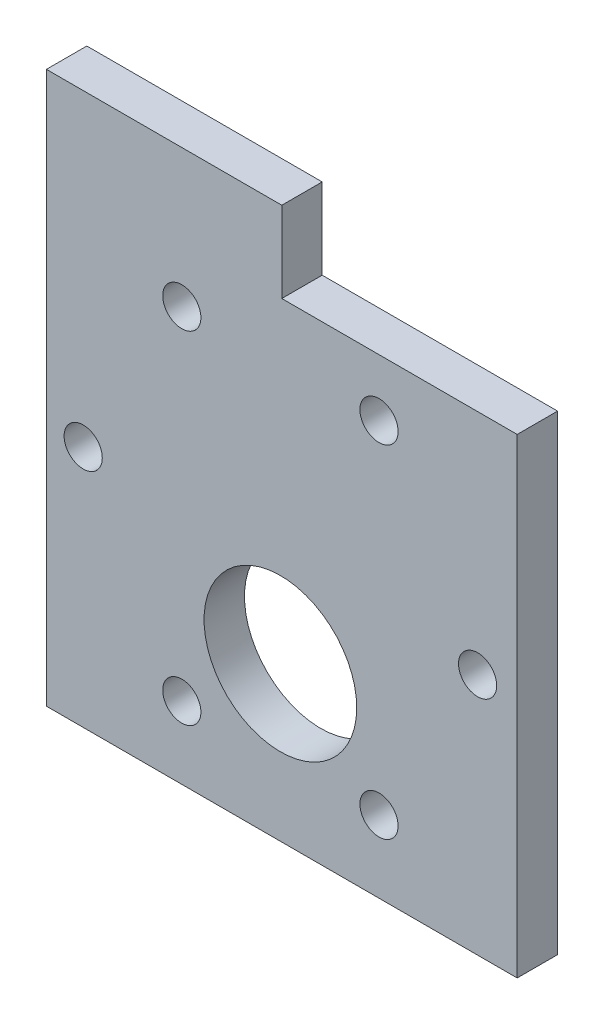
ISO-10303-21;
HEADER;
FILE_DESCRIPTION(('STEP AP214'),'2;1');
FILE_NAME('part.step','',(''),(''),'','','');
FILE_SCHEMA(('AUTOMOTIVE_DESIGN { 1 0 10303 214 1 1 1 1 }'));
ENDSEC;
DATA;
#1=APPLICATION_CONTEXT('core data for automotive mechanical design processes');
#2=APPLICATION_PROTOCOL_DEFINITION('international standard','automotive_design',2000,#1);
#3=PRODUCT_CONTEXT('',#1,'mechanical');
#4=PRODUCT('Part','Part','',(#3));
#5=PRODUCT_RELATED_PRODUCT_CATEGORY('part','',(#4));
#6=PRODUCT_DEFINITION_FORMATION('','',#4);
#7=PRODUCT_DEFINITION_CONTEXT('part definition',#1,'design');
#8=PRODUCT_DEFINITION('design','',#6,#7);
#9=PRODUCT_DEFINITION_SHAPE('','',#8);
#10=(LENGTH_UNIT() NAMED_UNIT(*) SI_UNIT(.MILLI.,.METRE.));
#11=(NAMED_UNIT(*) PLANE_ANGLE_UNIT() SI_UNIT($,.RADIAN.));
#12=(NAMED_UNIT(*) SI_UNIT($,.STERADIAN.) SOLID_ANGLE_UNIT());
#13=UNCERTAINTY_MEASURE_WITH_UNIT(LENGTH_MEASURE(1.E-05),#10,'distance_accuracy_value','');
#14=(GEOMETRIC_REPRESENTATION_CONTEXT(3) GLOBAL_UNCERTAINTY_ASSIGNED_CONTEXT((#13)) GLOBAL_UNIT_ASSIGNED_CONTEXT((#10,
#11,#12)) REPRESENTATION_CONTEXT('',''));
#15=CARTESIAN_POINT('',(0.,0.,0.));
#16=DIRECTION('',(0.,0.,1.));
#17=DIRECTION('',(1.,0.,0.));
#18=AXIS2_PLACEMENT_3D('',#15,#16,#17);
#19=CARTESIAN_POINT('',(0.,0.,3.175));
#20=DIRECTION('',(0.,0.,-1.));
#21=DIRECTION('',(-1.,0.,0.));
#22=AXIS2_PLACEMENT_3D('',#19,#20,#21);
#23=PLANE('',#22);
#24=DIRECTION('',(1.,0.,0.));
#25=VECTOR('',#24,1.);
#26=CARTESIAN_POINT('',(18.5,0.,3.175));
#27=LINE('',#26,#25);
#28=CARTESIAN_POINT('',(0.,0.,3.175));
#29=VERTEX_POINT('',#28);
#30=CARTESIAN_POINT('',(37.,0.,3.175));
#31=VERTEX_POINT('',#30);
#32=EDGE_CURVE('E82',#29,#31,#27,.T.);
#33=ORIENTED_EDGE('',*,*,#32,.T.);
#34=DIRECTION('',(0.,1.,0.));
#35=VECTOR('',#34,1.);
#36=CARTESIAN_POINT('',(37.,0.,3.175));
#37=LINE('',#36,#35);
#38=CARTESIAN_POINT('',(37.,37.,3.175));
#39=VERTEX_POINT('',#38);
#40=EDGE_CURVE('E143',#31,#39,#37,.T.);
#41=ORIENTED_EDGE('',*,*,#40,.T.);
#42=DIRECTION('',(-1.,0.,0.));
#43=VECTOR('',#42,1.);
#44=CARTESIAN_POINT('',(18.5,37.,3.175));
#45=LINE('',#44,#43);
#46=CARTESIAN_POINT('',(18.5,37.,3.175));
#47=VERTEX_POINT('',#46);
#48=EDGE_CURVE('E97',#39,#47,#45,.T.);
#49=ORIENTED_EDGE('',*,*,#48,.T.);
#50=DIRECTION('',(0.,1.,0.));
#51=VECTOR('',#50,1.);
#52=CARTESIAN_POINT('',(18.5,37.,3.175));
#53=LINE('',#52,#51);
#54=CARTESIAN_POINT('',(18.5,43.35,3.175));
#55=VERTEX_POINT('',#54);
#56=EDGE_CURVE('E90',#47,#55,#53,.T.);
#57=ORIENTED_EDGE('',*,*,#56,.T.);
#58=DIRECTION('',(-1.,0.,0.));
#59=VECTOR('',#58,1.);
#60=CARTESIAN_POINT('',(18.5,43.35,3.175));
#61=LINE('',#60,#59);
#62=CARTESIAN_POINT('',(0.,43.35,3.175));
#63=VERTEX_POINT('',#62);
#64=EDGE_CURVE('E94',#55,#63,#61,.T.);
#65=ORIENTED_EDGE('',*,*,#64,.T.);
#66=DIRECTION('',(0.,-1.,0.));
#67=VECTOR('',#66,1.);
#68=CARTESIAN_POINT('',(0.,43.35,3.175));
#69=LINE('',#68,#67);
#70=EDGE_CURVE('E50',#63,#29,#69,.T.);
#71=ORIENTED_EDGE('',*,*,#70,.T.);
#72=EDGE_LOOP('',(#33,#41,#49,#57,#65,#71));
#73=FACE_BOUND('',#72,.T.);
#74=CARTESIAN_POINT('',(18.3902331199689,12.0898739119919,3.175));
#75=DIRECTION('',(0.,0.,1.));
#76=DIRECTION('',(1.,0.,0.));
#77=AXIS2_PLACEMENT_3D('',#74,#75,#76);
#78=CIRCLE('',#77,6.00000000000002);
#79=CARTESIAN_POINT('',(24.3902331199689,12.0898739119919,3.175));
#80=VERTEX_POINT('',#79);
#81=EDGE_CURVE('E120',#80,#80,#78,.T.);
#82=ORIENTED_EDGE('',*,*,#81,.F.);
#83=EDGE_LOOP('',(#82));
#84=FACE_BOUND('',#83,.T.);
#85=CARTESIAN_POINT('',(2.89023311996889,19.089873911992,3.175));
#86=DIRECTION('',(0.,0.,1.));
#87=DIRECTION('',(1.,0.,0.));
#88=AXIS2_PLACEMENT_3D('',#85,#86,#87);
#89=CIRCLE('',#88,1.5);
#90=CARTESIAN_POINT('',(4.39023311996889,19.089873911992,3.175));
#91=VERTEX_POINT('',#90);
#92=EDGE_CURVE('E150',#91,#91,#89,.T.);
#93=ORIENTED_EDGE('',*,*,#92,.F.);
#94=EDGE_LOOP('',(#93));
#95=FACE_BOUND('',#94,.T.);
#96=CARTESIAN_POINT('',(10.6402331199689,5.66648015333317,3.175));
#97=DIRECTION('',(0.,0.,1.));
#98=DIRECTION('',(1.,0.,0.));
#99=AXIS2_PLACEMENT_3D('',#96,#97,#98);
#100=CIRCLE('',#99,1.5);
#101=CARTESIAN_POINT('',(12.1402331199689,5.66648015333317,3.175));
#102=VERTEX_POINT('',#101);
#103=EDGE_CURVE('E156',#102,#102,#100,.T.);
#104=ORIENTED_EDGE('',*,*,#103,.F.);
#105=EDGE_LOOP('',(#104));
#106=FACE_BOUND('',#105,.T.);
#107=CARTESIAN_POINT('',(26.1402331199689,5.66648015333317,3.175));
#108=DIRECTION('',(0.,0.,1.));
#109=DIRECTION('',(1.,0.,0.));
#110=AXIS2_PLACEMENT_3D('',#107,#108,#109);
#111=CIRCLE('',#110,1.5);
#112=CARTESIAN_POINT('',(27.6402331199689,5.66648015333317,3.175));
#113=VERTEX_POINT('',#112);
#114=EDGE_CURVE('E162',#113,#113,#111,.T.);
#115=ORIENTED_EDGE('',*,*,#114,.F.);
#116=EDGE_LOOP('',(#115));
#117=FACE_BOUND('',#116,.T.);
#118=CARTESIAN_POINT('',(33.8902331199689,19.089873911992,3.175));
#119=DIRECTION('',(0.,0.,1.));
#120=DIRECTION('',(1.,0.,0.));
#121=AXIS2_PLACEMENT_3D('',#118,#119,#120);
#122=CIRCLE('',#121,1.5);
#123=CARTESIAN_POINT('',(35.3902331199689,19.089873911992,3.175));
#124=VERTEX_POINT('',#123);
#125=EDGE_CURVE('E168',#124,#124,#122,.T.);
#126=ORIENTED_EDGE('',*,*,#125,.F.);
#127=EDGE_LOOP('',(#126));
#128=FACE_BOUND('',#127,.T.);
#129=CARTESIAN_POINT('',(26.1402331199689,32.5132676706507,3.175));
#130=DIRECTION('',(0.,0.,1.));
#131=DIRECTION('',(1.,0.,0.));
#132=AXIS2_PLACEMENT_3D('',#129,#130,#131);
#133=CIRCLE('',#132,1.5);
#134=CARTESIAN_POINT('',(27.6402331199689,32.5132676706507,3.175));
#135=VERTEX_POINT('',#134);
#136=EDGE_CURVE('E174',#135,#135,#133,.T.);
#137=ORIENTED_EDGE('',*,*,#136,.F.);
#138=EDGE_LOOP('',(#137));
#139=FACE_BOUND('',#138,.T.);
#140=CARTESIAN_POINT('',(10.6402331199689,32.5132676706507,3.175));
#141=DIRECTION('',(0.,0.,1.));
#142=DIRECTION('',(1.,0.,0.));
#143=AXIS2_PLACEMENT_3D('',#140,#141,#142);
#144=CIRCLE('',#143,1.5);
#145=CARTESIAN_POINT('',(12.1402331199689,32.5132676706507,3.175));
#146=VERTEX_POINT('',#145);
#147=EDGE_CURVE('E180',#146,#146,#144,.T.);
#148=ORIENTED_EDGE('',*,*,#147,.F.);
#149=EDGE_LOOP('',(#148));
#150=FACE_BOUND('',#149,.T.);
#151=ADVANCED_FACE('F33',(#73,#84,#95,#106,#117,#128,#139,#150),#23,.F.);
#152=CARTESIAN_POINT('',(0.,0.,0.));
#153=DIRECTION('',(0.,0.,-1.));
#154=DIRECTION('',(-1.,0.,0.));
#155=AXIS2_PLACEMENT_3D('',#152,#153,#154);
#156=PLANE('',#155);
#157=CARTESIAN_POINT('',(26.1402331199689,32.5132676706507,0.));
#158=DIRECTION('',(0.,0.,1.));
#159=DIRECTION('',(1.,0.,0.));
#160=AXIS2_PLACEMENT_3D('',#157,#158,#159);
#161=CIRCLE('',#160,1.5);
#162=CARTESIAN_POINT('',(27.6402331199689,32.5132676706507,0.));
#163=VERTEX_POINT('',#162);
#164=EDGE_CURVE('E177',#163,#163,#161,.T.);
#165=ORIENTED_EDGE('',*,*,#164,.T.);
#166=EDGE_LOOP('',(#165));
#167=FACE_BOUND('',#166,.T.);
#168=CARTESIAN_POINT('',(26.1402331199689,5.66648015333317,0.));
#169=DIRECTION('',(0.,0.,1.));
#170=DIRECTION('',(1.,0.,0.));
#171=AXIS2_PLACEMENT_3D('',#168,#169,#170);
#172=CIRCLE('',#171,1.5);
#173=CARTESIAN_POINT('',(27.6402331199689,5.66648015333317,0.));
#174=VERTEX_POINT('',#173);
#175=EDGE_CURVE('E165',#174,#174,#172,.T.);
#176=ORIENTED_EDGE('',*,*,#175,.T.);
#177=EDGE_LOOP('',(#176));
#178=FACE_BOUND('',#177,.T.);
#179=CARTESIAN_POINT('',(2.89023311996889,19.089873911992,0.));
#180=DIRECTION('',(0.,0.,1.));
#181=DIRECTION('',(1.,0.,0.));
#182=AXIS2_PLACEMENT_3D('',#179,#180,#181);
#183=CIRCLE('',#182,1.5);
#184=CARTESIAN_POINT('',(4.39023311996889,19.089873911992,0.));
#185=VERTEX_POINT('',#184);
#186=EDGE_CURVE('E153',#185,#185,#183,.T.);
#187=ORIENTED_EDGE('',*,*,#186,.T.);
#188=EDGE_LOOP('',(#187));
#189=FACE_BOUND('',#188,.T.);
#190=DIRECTION('',(1.,0.,0.));
#191=VECTOR('',#190,1.);
#192=CARTESIAN_POINT('',(18.5,0.,0.));
#193=LINE('',#192,#191);
#194=CARTESIAN_POINT('',(0.,0.,0.));
#195=VERTEX_POINT('',#194);
#196=CARTESIAN_POINT('',(37.,0.,0.));
#197=VERTEX_POINT('',#196);
#198=EDGE_CURVE('E77',#195,#197,#193,.T.);
#199=ORIENTED_EDGE('',*,*,#198,.F.);
#200=DIRECTION('',(0.,-1.,0.));
#201=VECTOR('',#200,1.);
#202=CARTESIAN_POINT('',(0.,0.,0.));
#203=LINE('',#202,#201);
#204=CARTESIAN_POINT('',(0.,43.35,0.));
#205=VERTEX_POINT('',#204);
#206=EDGE_CURVE('E73',#205,#195,#203,.T.);
#207=ORIENTED_EDGE('',*,*,#206,.F.);
#208=DIRECTION('',(-1.,0.,0.));
#209=VECTOR('',#208,1.);
#210=CARTESIAN_POINT('',(18.5,43.35,0.));
#211=LINE('',#210,#209);
#212=CARTESIAN_POINT('',(18.5,43.35,0.));
#213=VERTEX_POINT('',#212);
#214=EDGE_CURVE('E125',#213,#205,#211,.T.);
#215=ORIENTED_EDGE('',*,*,#214,.F.);
#216=DIRECTION('',(0.,1.,0.));
#217=VECTOR('',#216,1.);
#218=CARTESIAN_POINT('',(18.5,37.,0.));
#219=LINE('',#218,#217);
#220=CARTESIAN_POINT('',(18.5,37.,0.));
#221=VERTEX_POINT('',#220);
#222=EDGE_CURVE('E106',#221,#213,#219,.T.);
#223=ORIENTED_EDGE('',*,*,#222,.F.);
#224=DIRECTION('',(-1.,0.,0.));
#225=VECTOR('',#224,1.);
#226=CARTESIAN_POINT('',(18.5,37.,0.));
#227=LINE('',#226,#225);
#228=CARTESIAN_POINT('',(37.,37.,0.));
#229=VERTEX_POINT('',#228);
#230=EDGE_CURVE('E122',#229,#221,#227,.T.);
#231=ORIENTED_EDGE('',*,*,#230,.F.);
#232=DIRECTION('',(0.,1.,0.));
#233=VECTOR('',#232,1.);
#234=CARTESIAN_POINT('',(37.,0.,0.));
#235=LINE('',#234,#233);
#236=EDGE_CURVE('E119',#197,#229,#235,.T.);
#237=ORIENTED_EDGE('',*,*,#236,.F.);
#238=EDGE_LOOP('',(#199,#207,#215,#223,#231,#237));
#239=FACE_BOUND('',#238,.T.);
#240=CARTESIAN_POINT('',(18.3902331199689,12.0898739119919,0.));
#241=DIRECTION('',(0.,0.,1.));
#242=DIRECTION('',(1.,0.,0.));
#243=AXIS2_PLACEMENT_3D('',#240,#241,#242);
#244=CIRCLE('',#243,6.00000000000002);
#245=CARTESIAN_POINT('',(24.3902331199689,12.0898739119919,0.));
#246=VERTEX_POINT('',#245);
#247=EDGE_CURVE('E147',#246,#246,#244,.T.);
#248=ORIENTED_EDGE('',*,*,#247,.T.);
#249=EDGE_LOOP('',(#248));
#250=FACE_BOUND('',#249,.T.);
#251=CARTESIAN_POINT('',(10.6402331199689,5.66648015333317,0.));
#252=DIRECTION('',(0.,0.,1.));
#253=DIRECTION('',(1.,0.,0.));
#254=AXIS2_PLACEMENT_3D('',#251,#252,#253);
#255=CIRCLE('',#254,1.5);
#256=CARTESIAN_POINT('',(12.1402331199689,5.66648015333317,0.));
#257=VERTEX_POINT('',#256);
#258=EDGE_CURVE('E159',#257,#257,#255,.T.);
#259=ORIENTED_EDGE('',*,*,#258,.T.);
#260=EDGE_LOOP('',(#259));
#261=FACE_BOUND('',#260,.T.);
#262=CARTESIAN_POINT('',(33.8902331199689,19.089873911992,0.));
#263=DIRECTION('',(0.,0.,1.));
#264=DIRECTION('',(1.,0.,0.));
#265=AXIS2_PLACEMENT_3D('',#262,#263,#264);
#266=CIRCLE('',#265,1.5);
#267=CARTESIAN_POINT('',(35.3902331199689,19.089873911992,0.));
#268=VERTEX_POINT('',#267);
#269=EDGE_CURVE('E171',#268,#268,#266,.T.);
#270=ORIENTED_EDGE('',*,*,#269,.T.);
#271=EDGE_LOOP('',(#270));
#272=FACE_BOUND('',#271,.T.);
#273=CARTESIAN_POINT('',(10.6402331199689,32.5132676706507,0.));
#274=DIRECTION('',(0.,0.,1.));
#275=DIRECTION('',(1.,0.,0.));
#276=AXIS2_PLACEMENT_3D('',#273,#274,#275);
#277=CIRCLE('',#276,1.5);
#278=CARTESIAN_POINT('',(12.1402331199689,32.5132676706507,0.));
#279=VERTEX_POINT('',#278);
#280=EDGE_CURVE('E183',#279,#279,#277,.T.);
#281=ORIENTED_EDGE('',*,*,#280,.T.);
#282=EDGE_LOOP('',(#281));
#283=FACE_BOUND('',#282,.T.);
#284=ADVANCED_FACE('F138',(#167,#178,#189,#239,#250,#261,#272,#283),#156,.T.);
#285=CARTESIAN_POINT('',(18.5,0.,3.175));
#286=DIRECTION('',(0.,1.,0.));
#287=DIRECTION('',(-1.,0.,0.));
#288=AXIS2_PLACEMENT_3D('',#285,#286,#287);
#289=PLANE('',#288);
#290=ORIENTED_EDGE('',*,*,#198,.T.);
#291=DIRECTION('',(0.,0.,-1.));
#292=VECTOR('',#291,1.);
#293=CARTESIAN_POINT('',(37.,0.,3.175));
#294=LINE('',#293,#292);
#295=EDGE_CURVE('E11',#31,#197,#294,.T.);
#296=ORIENTED_EDGE('',*,*,#295,.F.);
#297=ORIENTED_EDGE('',*,*,#32,.F.);
#298=DIRECTION('',(0.,0.,-1.));
#299=VECTOR('',#298,1.);
#300=CARTESIAN_POINT('',(0.,0.,3.175));
#301=LINE('',#300,#299);
#302=EDGE_CURVE('E114',#29,#195,#301,.T.);
#303=ORIENTED_EDGE('',*,*,#302,.T.);
#304=EDGE_LOOP('',(#290,#296,#297,#303));
#305=FACE_BOUND('',#304,.T.);
#306=ADVANCED_FACE('F35',(#305),#289,.F.);
#307=CARTESIAN_POINT('',(37.,0.,3.175));
#308=DIRECTION('',(-1.,0.,0.));
#309=DIRECTION('',(0.,0.,1.));
#310=AXIS2_PLACEMENT_3D('',#307,#308,#309);
#311=PLANE('',#310);
#312=ORIENTED_EDGE('',*,*,#236,.T.);
#313=DIRECTION('',(0.,0.,-1.));
#314=VECTOR('',#313,1.);
#315=CARTESIAN_POINT('',(37.,37.,3.175));
#316=LINE('',#315,#314);
#317=EDGE_CURVE('E42',#39,#229,#316,.T.);
#318=ORIENTED_EDGE('',*,*,#317,.F.);
#319=ORIENTED_EDGE('',*,*,#40,.F.);
#320=ORIENTED_EDGE('',*,*,#295,.T.);
#321=EDGE_LOOP('',(#312,#318,#319,#320));
#322=FACE_BOUND('',#321,.T.);
#323=ADVANCED_FACE('F210',(#322),#311,.F.);
#324=CARTESIAN_POINT('',(18.5,37.,3.175));
#325=DIRECTION('',(0.,-1.,0.));
#326=DIRECTION('',(0.,0.,-1.));
#327=AXIS2_PLACEMENT_3D('',#324,#325,#326);
#328=PLANE('',#327);
#329=ORIENTED_EDGE('',*,*,#230,.T.);
#330=DIRECTION('',(0.,0.,-1.));
#331=VECTOR('',#330,1.);
#332=CARTESIAN_POINT('',(18.5,37.,3.175));
#333=LINE('',#332,#331);
#334=EDGE_CURVE('E108',#47,#221,#333,.T.);
#335=ORIENTED_EDGE('',*,*,#334,.F.);
#336=ORIENTED_EDGE('',*,*,#48,.F.);
#337=ORIENTED_EDGE('',*,*,#317,.T.);
#338=EDGE_LOOP('',(#329,#335,#336,#337));
#339=FACE_BOUND('',#338,.T.);
#340=ADVANCED_FACE('F135',(#339),#328,.F.);
#341=CARTESIAN_POINT('',(18.5,37.,3.175));
#342=DIRECTION('',(-1.,0.,0.));
#343=DIRECTION('',(0.,0.,1.));
#344=AXIS2_PLACEMENT_3D('',#341,#342,#343);
#345=PLANE('',#344);
#346=ORIENTED_EDGE('',*,*,#222,.T.);
#347=DIRECTION('',(0.,0.,-1.));
#348=VECTOR('',#347,1.);
#349=CARTESIAN_POINT('',(18.5,43.35,3.175));
#350=LINE('',#349,#348);
#351=EDGE_CURVE('E103',#55,#213,#350,.T.);
#352=ORIENTED_EDGE('',*,*,#351,.F.);
#353=ORIENTED_EDGE('',*,*,#56,.F.);
#354=ORIENTED_EDGE('',*,*,#334,.T.);
#355=EDGE_LOOP('',(#346,#352,#353,#354));
#356=FACE_BOUND('',#355,.T.);
#357=ADVANCED_FACE('F104',(#356),#345,.F.);
#358=CARTESIAN_POINT('',(18.5,43.35,3.175));
#359=DIRECTION('',(0.,-1.,0.));
#360=DIRECTION('',(0.,0.,-1.));
#361=AXIS2_PLACEMENT_3D('',#358,#359,#360);
#362=PLANE('',#361);
#363=ORIENTED_EDGE('',*,*,#214,.T.);
#364=DIRECTION('',(0.,0.,-1.));
#365=VECTOR('',#364,1.);
#366=CARTESIAN_POINT('',(0.,43.35,3.175));
#367=LINE('',#366,#365);
#368=EDGE_CURVE('E109',#63,#205,#367,.T.);
#369=ORIENTED_EDGE('',*,*,#368,.F.);
#370=ORIENTED_EDGE('',*,*,#64,.F.);
#371=ORIENTED_EDGE('',*,*,#351,.T.);
#372=EDGE_LOOP('',(#363,#369,#370,#371));
#373=FACE_BOUND('',#372,.T.);
#374=ADVANCED_FACE('F111',(#373),#362,.F.);
#375=CARTESIAN_POINT('',(0.,0.,3.175));
#376=DIRECTION('',(1.,0.,0.));
#377=DIRECTION('',(0.,0.,-1.));
#378=AXIS2_PLACEMENT_3D('',#375,#376,#377);
#379=PLANE('',#378);
#380=ORIENTED_EDGE('',*,*,#206,.T.);
#381=ORIENTED_EDGE('',*,*,#302,.F.);
#382=ORIENTED_EDGE('',*,*,#70,.F.);
#383=ORIENTED_EDGE('',*,*,#368,.T.);
#384=EDGE_LOOP('',(#380,#381,#382,#383));
#385=FACE_BOUND('',#384,.T.);
#386=ADVANCED_FACE('F141',(#385),#379,.F.);
#387=CARTESIAN_POINT('',(18.3902331199689,12.0898739119919,3.175));
#388=DIRECTION('',(0.,0.,-1.));
#389=DIRECTION('',(-1.,0.,0.));
#390=AXIS2_PLACEMENT_3D('',#387,#388,#389);
#391=CYLINDRICAL_SURFACE('',#390,6.00000000000002);
#392=ORIENTED_EDGE('',*,*,#81,.T.);
#393=EDGE_LOOP('',(#392));
#394=FACE_BOUND('',#393,.T.);
#395=ORIENTED_EDGE('',*,*,#247,.F.);
#396=EDGE_LOOP('',(#395));
#397=FACE_BOUND('',#396,.T.);
#398=ADVANCED_FACE('F200',(#394,#397),#391,.F.);
#399=CARTESIAN_POINT('',(2.89023311996889,19.089873911992,3.175));
#400=DIRECTION('',(0.,0.,-1.));
#401=DIRECTION('',(-1.,0.,0.));
#402=AXIS2_PLACEMENT_3D('',#399,#400,#401);
#403=CYLINDRICAL_SURFACE('',#402,1.5);
#404=ORIENTED_EDGE('',*,*,#92,.T.);
#405=EDGE_LOOP('',(#404));
#406=FACE_BOUND('',#405,.T.);
#407=ORIENTED_EDGE('',*,*,#186,.F.);
#408=EDGE_LOOP('',(#407));
#409=FACE_BOUND('',#408,.T.);
#410=ADVANCED_FACE('F267',(#406,#409),#403,.F.);
#411=CARTESIAN_POINT('',(10.6402331199689,5.66648015333317,3.175));
#412=DIRECTION('',(0.,0.,-1.));
#413=DIRECTION('',(-1.,0.,0.));
#414=AXIS2_PLACEMENT_3D('',#411,#412,#413);
#415=CYLINDRICAL_SURFACE('',#414,1.5);
#416=ORIENTED_EDGE('',*,*,#103,.T.);
#417=EDGE_LOOP('',(#416));
#418=FACE_BOUND('',#417,.T.);
#419=ORIENTED_EDGE('',*,*,#258,.F.);
#420=EDGE_LOOP('',(#419));
#421=FACE_BOUND('',#420,.T.);
#422=ADVANCED_FACE('F275',(#418,#421),#415,.F.);
#423=CARTESIAN_POINT('',(26.1402331199689,5.66648015333317,3.175));
#424=DIRECTION('',(0.,0.,-1.));
#425=DIRECTION('',(-1.,0.,0.));
#426=AXIS2_PLACEMENT_3D('',#423,#424,#425);
#427=CYLINDRICAL_SURFACE('',#426,1.5);
#428=ORIENTED_EDGE('',*,*,#114,.T.);
#429=EDGE_LOOP('',(#428));
#430=FACE_BOUND('',#429,.T.);
#431=ORIENTED_EDGE('',*,*,#175,.F.);
#432=EDGE_LOOP('',(#431));
#433=FACE_BOUND('',#432,.T.);
#434=ADVANCED_FACE('F283',(#430,#433),#427,.F.);
#435=CARTESIAN_POINT('',(33.8902331199689,19.089873911992,3.175));
#436=DIRECTION('',(0.,0.,-1.));
#437=DIRECTION('',(-1.,0.,0.));
#438=AXIS2_PLACEMENT_3D('',#435,#436,#437);
#439=CYLINDRICAL_SURFACE('',#438,1.5);
#440=ORIENTED_EDGE('',*,*,#125,.T.);
#441=EDGE_LOOP('',(#440));
#442=FACE_BOUND('',#441,.T.);
#443=ORIENTED_EDGE('',*,*,#269,.F.);
#444=EDGE_LOOP('',(#443));
#445=FACE_BOUND('',#444,.T.);
#446=ADVANCED_FACE('F292',(#442,#445),#439,.F.);
#447=CARTESIAN_POINT('',(26.1402331199689,32.5132676706507,3.175));
#448=DIRECTION('',(0.,0.,-1.));
#449=DIRECTION('',(-1.,0.,0.));
#450=AXIS2_PLACEMENT_3D('',#447,#448,#449);
#451=CYLINDRICAL_SURFACE('',#450,1.5);
#452=ORIENTED_EDGE('',*,*,#136,.T.);
#453=EDGE_LOOP('',(#452));
#454=FACE_BOUND('',#453,.T.);
#455=ORIENTED_EDGE('',*,*,#164,.F.);
#456=EDGE_LOOP('',(#455));
#457=FACE_BOUND('',#456,.T.);
#458=ADVANCED_FACE('F301',(#454,#457),#451,.F.);
#459=CARTESIAN_POINT('',(10.6402331199689,32.5132676706507,3.175));
#460=DIRECTION('',(0.,0.,-1.));
#461=DIRECTION('',(-1.,0.,0.));
#462=AXIS2_PLACEMENT_3D('',#459,#460,#461);
#463=CYLINDRICAL_SURFACE('',#462,1.5);
#464=ORIENTED_EDGE('',*,*,#147,.T.);
#465=EDGE_LOOP('',(#464));
#466=FACE_BOUND('',#465,.T.);
#467=ORIENTED_EDGE('',*,*,#280,.F.);
#468=EDGE_LOOP('',(#467));
#469=FACE_BOUND('',#468,.T.);
#470=ADVANCED_FACE('F189',(#466,#469),#463,.F.);
#471=CLOSED_SHELL('',(#151,#284,#306,#323,#340,#357,#374,#386,#398,#410,#422,#434,#446,#458,#470));
#472=MANIFOLD_SOLID_BREP('B2',#471);
#473=ADVANCED_BREP_SHAPE_REPRESENTATION('',(#18,#472),#14);
#474=SHAPE_DEFINITION_REPRESENTATION(#9,#473);
ENDSEC;
END-ISO-10303-21;
